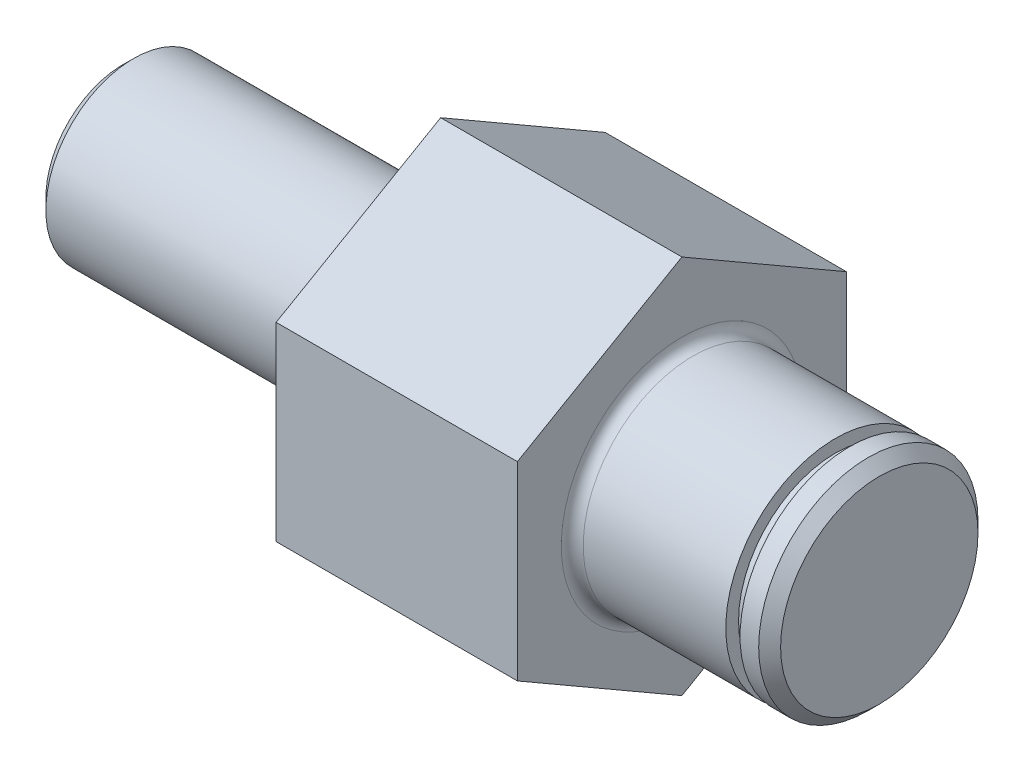
ISO-10303-21;
HEADER;
FILE_DESCRIPTION(('STEP AP214'),'2;1');
FILE_NAME('part.step','',(''),(''),'','','');
FILE_SCHEMA(('AUTOMOTIVE_DESIGN { 1 0 10303 214 1 1 1 1 }'));
ENDSEC;
DATA;
#1=APPLICATION_CONTEXT('core data for automotive mechanical design processes');
#2=APPLICATION_PROTOCOL_DEFINITION('international standard','automotive_design',2000,#1);
#3=PRODUCT_CONTEXT('',#1,'mechanical');
#4=PRODUCT('Part','Part','',(#3));
#5=PRODUCT_RELATED_PRODUCT_CATEGORY('part','',(#4));
#6=PRODUCT_DEFINITION_FORMATION('','',#4);
#7=PRODUCT_DEFINITION_CONTEXT('part definition',#1,'design');
#8=PRODUCT_DEFINITION('design','',#6,#7);
#9=PRODUCT_DEFINITION_SHAPE('','',#8);
#10=(LENGTH_UNIT() NAMED_UNIT(*) SI_UNIT(.MILLI.,.METRE.));
#11=(NAMED_UNIT(*) PLANE_ANGLE_UNIT() SI_UNIT($,.RADIAN.));
#12=(NAMED_UNIT(*) SI_UNIT($,.STERADIAN.) SOLID_ANGLE_UNIT());
#13=UNCERTAINTY_MEASURE_WITH_UNIT(LENGTH_MEASURE(1.E-05),#10,'distance_accuracy_value','');
#14=(GEOMETRIC_REPRESENTATION_CONTEXT(3) GLOBAL_UNCERTAINTY_ASSIGNED_CONTEXT((#13)) GLOBAL_UNIT_ASSIGNED_CONTEXT((#10,
#11,#12)) REPRESENTATION_CONTEXT('',''));
#15=CARTESIAN_POINT('',(0.,0.,0.));
#16=DIRECTION('',(0.,0.,1.));
#17=DIRECTION('',(1.,0.,0.));
#18=AXIS2_PLACEMENT_3D('',#15,#16,#17);
#19=CARTESIAN_POINT('',(69.,0.,0.));
#20=DIRECTION('',(1.,0.,0.));
#21=DIRECTION('',(0.,0.,-1.));
#22=AXIS2_PLACEMENT_3D('',#19,#20,#21);
#23=PLANE('',#22);
#24=CARTESIAN_POINT('',(68.9999999999987,0.,0.));
#25=DIRECTION('',(-1.,0.,0.));
#26=DIRECTION('',(0.,0.,1.));
#27=AXIS2_PLACEMENT_3D('',#24,#25,#26);
#28=CIRCLE('',#27,8.99999999999873);
#29=CARTESIAN_POINT('',(68.9999999999987,0.,8.99999999999873));
#30=VERTEX_POINT('',#29);
#31=EDGE_CURVE('E20',#30,#30,#28,.T.);
#32=ORIENTED_EDGE('',*,*,#31,.F.);
#33=EDGE_LOOP('',(#32));
#34=FACE_BOUND('',#33,.T.);
#35=ADVANCED_FACE('F17',(#34),#23,.T.);
#36=CARTESIAN_POINT('',(68.0000000000013,0.,0.));
#37=DIRECTION('',(-1.,0.,0.));
#38=DIRECTION('',(0.,0.,1.));
#39=AXIS2_PLACEMENT_3D('',#36,#37,#38);
#40=CONICAL_SURFACE('',#39,10.0000000000013,0.785398163400004);
#41=ORIENTED_EDGE('',*,*,#31,.T.);
#42=EDGE_LOOP('',(#41));
#43=FACE_BOUND('',#42,.T.);
#44=CARTESIAN_POINT('',(68.,0.,0.));
#45=DIRECTION('',(1.,0.,0.));
#46=DIRECTION('',(0.,0.,-1.));
#47=AXIS2_PLACEMENT_3D('',#44,#45,#46);
#48=CIRCLE('',#47,10.);
#49=CARTESIAN_POINT('',(68.,0.,-10.));
#50=VERTEX_POINT('',#49);
#51=EDGE_CURVE('E129',#50,#50,#48,.F.);
#52=ORIENTED_EDGE('',*,*,#51,.F.);
#53=EDGE_LOOP('',(#52));
#54=FACE_BOUND('',#53,.T.);
#55=ADVANCED_FACE('F160',(#43,#54),#40,.T.);
#56=CARTESIAN_POINT('',(67.65,0.,0.));
#57=DIRECTION('',(1.,0.,0.));
#58=DIRECTION('',(0.,0.,-1.));
#59=AXIS2_PLACEMENT_3D('',#56,#57,#58);
#60=CYLINDRICAL_SURFACE('',#59,10.);
#61=ORIENTED_EDGE('',*,*,#51,.T.);
#62=EDGE_LOOP('',(#61));
#63=FACE_BOUND('',#62,.T.);
#64=CARTESIAN_POINT('',(66.3,0.,0.));
#65=DIRECTION('',(1.,0.,0.));
#66=DIRECTION('',(0.,0.,-1.));
#67=AXIS2_PLACEMENT_3D('',#64,#65,#66);
#68=CIRCLE('',#67,10.);
#69=CARTESIAN_POINT('',(66.3,0.,-10.));
#70=VERTEX_POINT('',#69);
#71=EDGE_CURVE('E137',#70,#70,#68,.F.);
#72=ORIENTED_EDGE('',*,*,#71,.F.);
#73=EDGE_LOOP('',(#72));
#74=FACE_BOUND('',#73,.T.);
#75=ADVANCED_FACE('F158',(#63,#74),#60,.T.);
#76=CARTESIAN_POINT('',(66.3,10.,0.));
#77=DIRECTION('',(-1.,0.,0.));
#78=DIRECTION('',(0.,0.,1.));
#79=AXIS2_PLACEMENT_3D('',#76,#77,#78);
#80=PLANE('',#79);
#81=CARTESIAN_POINT('',(66.3,0.,0.));
#82=DIRECTION('',(1.,0.,0.));
#83=DIRECTION('',(0.,0.,-1.));
#84=AXIS2_PLACEMENT_3D('',#81,#82,#83);
#85=CIRCLE('',#84,8.83563681192345);
#86=CARTESIAN_POINT('',(66.3,0.,-8.83563681192345));
#87=VERTEX_POINT('',#86);
#88=EDGE_CURVE('E151',#87,#87,#85,.F.);
#89=ORIENTED_EDGE('',*,*,#88,.F.);
#90=EDGE_LOOP('',(#89));
#91=FACE_BOUND('',#90,.T.);
#92=ORIENTED_EDGE('',*,*,#71,.T.);
#93=EDGE_LOOP('',(#92));
#94=FACE_BOUND('',#93,.T.);
#95=ADVANCED_FACE('F156',(#91,#94),#80,.T.);
#96=CARTESIAN_POINT('',(65.65,0.,0.));
#97=DIRECTION('',(1.,0.,0.));
#98=DIRECTION('',(0.,0.,-1.));
#99=AXIS2_PLACEMENT_3D('',#96,#97,#98);
#100=CYLINDRICAL_SURFACE('',#99,8.83563681192345);
#101=ORIENTED_EDGE('',*,*,#88,.T.);
#102=EDGE_LOOP('',(#101));
#103=FACE_BOUND('',#102,.T.);
#104=CARTESIAN_POINT('',(65.,0.,0.));
#105=DIRECTION('',(1.,0.,0.));
#106=DIRECTION('',(0.,0.,-1.));
#107=AXIS2_PLACEMENT_3D('',#104,#105,#106);
#108=CIRCLE('',#107,8.83563681192345);
#109=CARTESIAN_POINT('',(65.,0.,-8.83563681192345));
#110=VERTEX_POINT('',#109);
#111=EDGE_CURVE('E148',#110,#110,#108,.F.);
#112=ORIENTED_EDGE('',*,*,#111,.F.);
#113=EDGE_LOOP('',(#112));
#114=FACE_BOUND('',#113,.T.);
#115=ADVANCED_FACE('F168',(#103,#114),#100,.T.);
#116=CARTESIAN_POINT('',(65.,8.83563681192345,0.));
#117=DIRECTION('',(1.,0.,0.));
#118=DIRECTION('',(0.,0.,-1.));
#119=AXIS2_PLACEMENT_3D('',#116,#117,#118);
#120=PLANE('',#119);
#121=ORIENTED_EDGE('',*,*,#111,.T.);
#122=EDGE_LOOP('',(#121));
#123=FACE_BOUND('',#122,.T.);
#124=CARTESIAN_POINT('',(65.,0.,0.));
#125=DIRECTION('',(1.,0.,0.));
#126=DIRECTION('',(0.,0.,-1.));
#127=AXIS2_PLACEMENT_3D('',#124,#125,#126);
#128=CIRCLE('',#127,10.);
#129=CARTESIAN_POINT('',(65.,0.,-10.));
#130=VERTEX_POINT('',#129);
#131=EDGE_CURVE('E144',#130,#130,#128,.F.);
#132=ORIENTED_EDGE('',*,*,#131,.F.);
#133=EDGE_LOOP('',(#132));
#134=FACE_BOUND('',#133,.T.);
#135=ADVANCED_FACE('F252',(#123,#134),#120,.T.);
#136=CARTESIAN_POINT('',(58.,0.,0.));
#137=DIRECTION('',(1.,0.,0.));
#138=DIRECTION('',(0.,0.,-1.));
#139=AXIS2_PLACEMENT_3D('',#136,#137,#138);
#140=CYLINDRICAL_SURFACE('',#139,10.);
#141=CARTESIAN_POINT('',(52.,0.,0.));
#142=DIRECTION('',(1.,0.,0.));
#143=DIRECTION('',(0.,0.,-1.));
#144=AXIS2_PLACEMENT_3D('',#141,#142,#143);
#145=CIRCLE('',#144,10.);
#146=CARTESIAN_POINT('',(52.,0.,-10.));
#147=VERTEX_POINT('',#146);
#148=EDGE_CURVE('E147',#147,#147,#145,.T.);
#149=ORIENTED_EDGE('',*,*,#148,.T.);
#150=EDGE_LOOP('',(#149));
#151=FACE_BOUND('',#150,.T.);
#152=ORIENTED_EDGE('',*,*,#131,.T.);
#153=EDGE_LOOP('',(#152));
#154=FACE_BOUND('',#153,.T.);
#155=ADVANCED_FACE('F120',(#151,#154),#140,.T.);
#156=CARTESIAN_POINT('',(52.,0.,0.));
#157=DIRECTION('',(1.,0.,0.));
#158=DIRECTION('',(0.,0.,-1.));
#159=AXIS2_PLACEMENT_3D('',#156,#157,#158);
#160=TOROIDAL_SURFACE('',#159,11.,1.);
#161=ORIENTED_EDGE('',*,*,#148,.F.);
#162=EDGE_LOOP('',(#161));
#163=FACE_BOUND('',#162,.T.);
#164=CARTESIAN_POINT('',(51.,0.,0.));
#165=DIRECTION('',(1.,0.,0.));
#166=DIRECTION('',(0.,1.,0.));
#167=AXIS2_PLACEMENT_3D('',#164,#165,#166);
#168=CIRCLE('',#167,11.);
#169=CARTESIAN_POINT('',(51.,11.,0.));
#170=VERTEX_POINT('',#169);
#171=EDGE_CURVE('E81',#170,#170,#168,.F.);
#172=ORIENTED_EDGE('',*,*,#171,.F.);
#173=EDGE_LOOP('',(#172));
#174=FACE_BOUND('',#173,.T.);
#175=ADVANCED_FACE('F115',(#163,#174),#160,.F.);
#176=CARTESIAN_POINT('',(51.,10.,0.));
#177=DIRECTION('',(1.,0.,0.));
#178=DIRECTION('',(0.,0.,-1.));
#179=AXIS2_PLACEMENT_3D('',#176,#177,#178);
#180=PLANE('',#179);
#181=ORIENTED_EDGE('',*,*,#171,.T.);
#182=EDGE_LOOP('',(#181));
#183=FACE_BOUND('',#182,.T.);
#184=DIRECTION('',(0.,1.,0.));
#185=VECTOR('',#184,1.);
#186=CARTESIAN_POINT('',(51.,8.66025403784439,-15.));
#187=LINE('',#186,#185);
#188=CARTESIAN_POINT('',(51.,8.6602540378444,-15.));
#189=VERTEX_POINT('',#188);
#190=CARTESIAN_POINT('',(51.,-8.66025403784439,-15.));
#191=VERTEX_POINT('',#190);
#192=EDGE_CURVE('E85',#189,#191,#187,.F.);
#193=ORIENTED_EDGE('',*,*,#192,.F.);
#194=DIRECTION('',(0.,0.5,0.866025403784439));
#195=VECTOR('',#194,1.);
#196=CARTESIAN_POINT('',(51.,17.3205080756888,0.));
#197=LINE('',#196,#195);
#198=CARTESIAN_POINT('',(51.,17.3205080756888,0.));
#199=VERTEX_POINT('',#198);
#200=EDGE_CURVE('E67',#199,#189,#197,.F.);
#201=ORIENTED_EDGE('',*,*,#200,.F.);
#202=DIRECTION('',(0.,-0.500000000000001,0.866025403784438));
#203=VECTOR('',#202,1.);
#204=CARTESIAN_POINT('',(51.,8.66025403784438,15.));
#205=LINE('',#204,#203);
#206=CARTESIAN_POINT('',(51.,8.66025403784438,15.));
#207=VERTEX_POINT('',#206);
#208=EDGE_CURVE('E72',#207,#199,#205,.F.);
#209=ORIENTED_EDGE('',*,*,#208,.F.);
#210=DIRECTION('',(0.,-1.,0.));
#211=VECTOR('',#210,1.);
#212=CARTESIAN_POINT('',(51.,-8.66025403784439,15.));
#213=LINE('',#212,#211);
#214=CARTESIAN_POINT('',(51.,-8.6602540378444,15.));
#215=VERTEX_POINT('',#214);
#216=EDGE_CURVE('E402',#215,#207,#213,.F.);
#217=ORIENTED_EDGE('',*,*,#216,.F.);
#218=DIRECTION('',(0.,-0.5,-0.866025403784439));
#219=VECTOR('',#218,1.);
#220=CARTESIAN_POINT('',(51.,-17.3205080756888,0.));
#221=LINE('',#220,#219);
#222=CARTESIAN_POINT('',(51.,-17.3205080756888,0.));
#223=VERTEX_POINT('',#222);
#224=EDGE_CURVE('E390',#223,#215,#221,.F.);
#225=ORIENTED_EDGE('',*,*,#224,.F.);
#226=DIRECTION('',(0.,0.5,-0.866025403784439));
#227=VECTOR('',#226,1.);
#228=CARTESIAN_POINT('',(51.,-8.66025403784439,-15.));
#229=LINE('',#228,#227);
#230=EDGE_CURVE('E389',#191,#223,#229,.F.);
#231=ORIENTED_EDGE('',*,*,#230,.F.);
#232=EDGE_LOOP('',(#193,#201,#209,#217,#225,#231));
#233=FACE_BOUND('',#232,.T.);
#234=ADVANCED_FACE('F83',(#183,#233),#180,.T.);
#235=CARTESIAN_POINT('',(51.,8.66025403784438,15.));
#236=DIRECTION('',(0.,0.866025403784438,0.500000000000001));
#237=DIRECTION('',(0.,-0.500000000000001,0.866025403784438));
#238=AXIS2_PLACEMENT_3D('',#235,#236,#237);
#239=PLANE('',#238);
#240=ORIENTED_EDGE('',*,*,#208,.T.);
#241=DIRECTION('',(1.,0.,0.));
#242=VECTOR('',#241,1.);
#243=CARTESIAN_POINT('',(51.,17.3205080756888,0.));
#244=LINE('',#243,#242);
#245=CARTESIAN_POINT('',(29.,17.3205080756888,0.));
#246=VERTEX_POINT('',#245);
#247=EDGE_CURVE('E74',#246,#199,#244,.T.);
#248=ORIENTED_EDGE('',*,*,#247,.F.);
#249=DIRECTION('',(0.,0.500000000000002,-0.866025403784438));
#250=VECTOR('',#249,1.);
#251=CARTESIAN_POINT('',(29.,8.66025403784438,15.));
#252=LINE('',#251,#250);
#253=CARTESIAN_POINT('',(29.,8.66025403784438,15.));
#254=VERTEX_POINT('',#253);
#255=EDGE_CURVE('E404',#254,#246,#252,.T.);
#256=ORIENTED_EDGE('',*,*,#255,.F.);
#257=DIRECTION('',(1.,0.,0.));
#258=VECTOR('',#257,1.);
#259=CARTESIAN_POINT('',(51.,8.66025403784438,15.));
#260=LINE('',#259,#258);
#261=EDGE_CURVE('E77',#207,#254,#260,.F.);
#262=ORIENTED_EDGE('',*,*,#261,.F.);
#263=EDGE_LOOP('',(#240,#248,#256,#262));
#264=FACE_BOUND('',#263,.T.);
#265=ADVANCED_FACE('F73',(#264),#239,.T.);
#266=CARTESIAN_POINT('',(51.,17.3205080756888,0.));
#267=DIRECTION('',(0.,0.866025403784439,-0.5));
#268=DIRECTION('',(0.,0.5,0.866025403784439));
#269=AXIS2_PLACEMENT_3D('',#266,#267,#268);
#270=PLANE('',#269);
#271=ORIENTED_EDGE('',*,*,#200,.T.);
#272=DIRECTION('',(1.,0.,0.));
#273=VECTOR('',#272,1.);
#274=CARTESIAN_POINT('',(51.,8.66025403784439,-15.));
#275=LINE('',#274,#273);
#276=CARTESIAN_POINT('',(29.,8.6602540378444,-15.));
#277=VERTEX_POINT('',#276);
#278=EDGE_CURVE('E87',#277,#189,#275,.T.);
#279=ORIENTED_EDGE('',*,*,#278,.F.);
#280=DIRECTION('',(0.,-0.500000000000001,-0.866025403784438));
#281=VECTOR('',#280,1.);
#282=CARTESIAN_POINT('',(29.,17.3205080756888,0.));
#283=LINE('',#282,#281);
#284=EDGE_CURVE('E91',#246,#277,#283,.T.);
#285=ORIENTED_EDGE('',*,*,#284,.F.);
#286=ORIENTED_EDGE('',*,*,#247,.T.);
#287=EDGE_LOOP('',(#271,#279,#285,#286));
#288=FACE_BOUND('',#287,.T.);
#289=ADVANCED_FACE('F89',(#288),#270,.T.);
#290=CARTESIAN_POINT('',(51.,8.66025403784439,-15.));
#291=DIRECTION('',(0.,0.,-1.));
#292=DIRECTION('',(0.,1.,0.));
#293=AXIS2_PLACEMENT_3D('',#290,#291,#292);
#294=PLANE('',#293);
#295=ORIENTED_EDGE('',*,*,#192,.T.);
#296=DIRECTION('',(1.,0.,0.));
#297=VECTOR('',#296,1.);
#298=CARTESIAN_POINT('',(51.,-8.66025403784439,-15.));
#299=LINE('',#298,#297);
#300=CARTESIAN_POINT('',(29.,-8.66025403784439,-15.));
#301=VERTEX_POINT('',#300);
#302=EDGE_CURVE('E385',#301,#191,#299,.T.);
#303=ORIENTED_EDGE('',*,*,#302,.F.);
#304=DIRECTION('',(0.,1.,0.));
#305=VECTOR('',#304,1.);
#306=CARTESIAN_POINT('',(29.,20.,-15.));
#307=LINE('',#306,#305);
#308=EDGE_CURVE('E416',#277,#301,#307,.F.);
#309=ORIENTED_EDGE('',*,*,#308,.F.);
#310=ORIENTED_EDGE('',*,*,#278,.T.);
#311=EDGE_LOOP('',(#295,#303,#309,#310));
#312=FACE_BOUND('',#311,.T.);
#313=ADVANCED_FACE('F226',(#312),#294,.T.);
#314=CARTESIAN_POINT('',(51.,-8.66025403784439,-15.));
#315=DIRECTION('',(0.,-0.866025403784439,-0.5));
#316=DIRECTION('',(0.,0.5,-0.866025403784439));
#317=AXIS2_PLACEMENT_3D('',#314,#315,#316);
#318=PLANE('',#317);
#319=ORIENTED_EDGE('',*,*,#230,.T.);
#320=DIRECTION('',(1.,0.,0.));
#321=VECTOR('',#320,1.);
#322=CARTESIAN_POINT('',(51.,-17.3205080756888,0.));
#323=LINE('',#322,#321);
#324=CARTESIAN_POINT('',(29.,-17.3205080756888,0.));
#325=VERTEX_POINT('',#324);
#326=EDGE_CURVE('E392',#325,#223,#323,.T.);
#327=ORIENTED_EDGE('',*,*,#326,.F.);
#328=DIRECTION('',(0.,-0.500000000000001,0.866025403784438));
#329=VECTOR('',#328,1.);
#330=CARTESIAN_POINT('',(29.,-8.66025403784439,-15.));
#331=LINE('',#330,#329);
#332=EDGE_CURVE('E395',#301,#325,#331,.T.);
#333=ORIENTED_EDGE('',*,*,#332,.F.);
#334=ORIENTED_EDGE('',*,*,#302,.T.);
#335=EDGE_LOOP('',(#319,#327,#333,#334));
#336=FACE_BOUND('',#335,.T.);
#337=ADVANCED_FACE('F223',(#336),#318,.T.);
#338=CARTESIAN_POINT('',(51.,-17.3205080756888,0.));
#339=DIRECTION('',(0.,-0.866025403784439,0.5));
#340=DIRECTION('',(0.,-0.5,-0.866025403784439));
#341=AXIS2_PLACEMENT_3D('',#338,#339,#340);
#342=PLANE('',#341);
#343=ORIENTED_EDGE('',*,*,#224,.T.);
#344=DIRECTION('',(1.,0.,0.));
#345=VECTOR('',#344,1.);
#346=CARTESIAN_POINT('',(51.,-8.66025403784439,15.));
#347=LINE('',#346,#345);
#348=CARTESIAN_POINT('',(29.,-8.6602540378444,15.));
#349=VERTEX_POINT('',#348);
#350=EDGE_CURVE('E35',#349,#215,#347,.T.);
#351=ORIENTED_EDGE('',*,*,#350,.F.);
#352=DIRECTION('',(0.,0.500000000000001,0.866025403784438));
#353=VECTOR('',#352,1.);
#354=CARTESIAN_POINT('',(29.,-17.3205080756888,0.));
#355=LINE('',#354,#353);
#356=EDGE_CURVE('E418',#325,#349,#355,.T.);
#357=ORIENTED_EDGE('',*,*,#356,.F.);
#358=ORIENTED_EDGE('',*,*,#326,.T.);
#359=EDGE_LOOP('',(#343,#351,#357,#358));
#360=FACE_BOUND('',#359,.T.);
#361=ADVANCED_FACE('F219',(#360),#342,.T.);
#362=CARTESIAN_POINT('',(51.,-8.66025403784439,15.));
#363=DIRECTION('',(0.,0.,1.));
#364=DIRECTION('',(0.,-1.,0.));
#365=AXIS2_PLACEMENT_3D('',#362,#363,#364);
#366=PLANE('',#365);
#367=ORIENTED_EDGE('',*,*,#216,.T.);
#368=ORIENTED_EDGE('',*,*,#261,.T.);
#369=DIRECTION('',(0.,1.,0.));
#370=VECTOR('',#369,1.);
#371=CARTESIAN_POINT('',(29.,20.,15.));
#372=LINE('',#371,#370);
#373=EDGE_CURVE('E205',#349,#254,#372,.T.);
#374=ORIENTED_EDGE('',*,*,#373,.F.);
#375=ORIENTED_EDGE('',*,*,#350,.T.);
#376=EDGE_LOOP('',(#367,#368,#374,#375));
#377=FACE_BOUND('',#376,.T.);
#378=ADVANCED_FACE('F216',(#377),#366,.T.);
#379=CARTESIAN_POINT('',(29.,20.,0.));
#380=DIRECTION('',(-1.,0.,0.));
#381=DIRECTION('',(0.,0.,1.));
#382=AXIS2_PLACEMENT_3D('',#379,#380,#381);
#383=PLANE('',#382);
#384=CARTESIAN_POINT('',(29.,0.,0.));
#385=DIRECTION('',(-1.,0.,0.));
#386=DIRECTION('',(0.,1.,0.));
#387=AXIS2_PLACEMENT_3D('',#384,#385,#386);
#388=CIRCLE('',#387,9.);
#389=CARTESIAN_POINT('',(29.,9.,0.));
#390=VERTEX_POINT('',#389);
#391=EDGE_CURVE('E143',#390,#390,#388,.F.);
#392=ORIENTED_EDGE('',*,*,#391,.T.);
#393=EDGE_LOOP('',(#392));
#394=FACE_BOUND('',#393,.T.);
#395=ORIENTED_EDGE('',*,*,#356,.T.);
#396=ORIENTED_EDGE('',*,*,#373,.T.);
#397=ORIENTED_EDGE('',*,*,#255,.T.);
#398=ORIENTED_EDGE('',*,*,#284,.T.);
#399=ORIENTED_EDGE('',*,*,#308,.T.);
#400=ORIENTED_EDGE('',*,*,#332,.T.);
#401=EDGE_LOOP('',(#395,#396,#397,#398,#399,#400));
#402=FACE_BOUND('',#401,.T.);
#403=ADVANCED_FACE('F207',(#394,#402),#383,.T.);
#404=CARTESIAN_POINT('',(0.,8.,0.));
#405=DIRECTION('',(-1.,0.,0.));
#406=DIRECTION('',(0.,0.,1.));
#407=AXIS2_PLACEMENT_3D('',#404,#405,#406);
#408=PLANE('',#407);
#409=CARTESIAN_POINT('',(1.27653963788443E-12,0.,0.));
#410=DIRECTION('',(1.,0.,0.));
#411=DIRECTION('',(0.,0.,-1.));
#412=AXIS2_PLACEMENT_3D('',#409,#410,#411);
#413=CIRCLE('',#412,6.99999999999872);
#414=CARTESIAN_POINT('',(1.27644477019434E-12,0.,-6.99999999999872));
#415=VERTEX_POINT('',#414);
#416=EDGE_CURVE('E140',#415,#415,#413,.T.);
#417=ORIENTED_EDGE('',*,*,#416,.F.);
#418=EDGE_LOOP('',(#417));
#419=FACE_BOUND('',#418,.T.);
#420=ADVANCED_FACE('F189',(#419),#408,.T.);
#421=CARTESIAN_POINT('',(28.,0.,0.));
#422=DIRECTION('',(1.,0.,0.));
#423=DIRECTION('',(0.,0.,-1.));
#424=AXIS2_PLACEMENT_3D('',#421,#422,#423);
#425=TOROIDAL_SURFACE('',#424,9.,1.);
#426=ORIENTED_EDGE('',*,*,#391,.F.);
#427=EDGE_LOOP('',(#426));
#428=FACE_BOUND('',#427,.T.);
#429=CARTESIAN_POINT('',(28.,0.,0.));
#430=DIRECTION('',(1.,0.,0.));
#431=DIRECTION('',(0.,0.,-1.));
#432=AXIS2_PLACEMENT_3D('',#429,#430,#431);
#433=CIRCLE('',#432,8.);
#434=CARTESIAN_POINT('',(28.,0.,-8.));
#435=VERTEX_POINT('',#434);
#436=EDGE_CURVE('E26',#435,#435,#433,.F.);
#437=ORIENTED_EDGE('',*,*,#436,.F.);
#438=EDGE_LOOP('',(#437));
#439=FACE_BOUND('',#438,.T.);
#440=ADVANCED_FACE('F180',(#428,#439),#425,.F.);
#441=CARTESIAN_POINT('',(0.999999999998724,0.,0.));
#442=DIRECTION('',(1.,0.,0.));
#443=DIRECTION('',(0.,0.,-1.));
#444=AXIS2_PLACEMENT_3D('',#441,#442,#443);
#445=CONICAL_SURFACE('',#444,8.00000000000128,0.7853981634);
#446=CARTESIAN_POINT('',(0.999999999999999,0.,0.));
#447=DIRECTION('',(1.,0.,0.));
#448=DIRECTION('',(0.,0.,-1.));
#449=AXIS2_PLACEMENT_3D('',#446,#447,#448);
#450=CIRCLE('',#449,8.);
#451=CARTESIAN_POINT('',(0.999999999999999,0.,-8.));
#452=VERTEX_POINT('',#451);
#453=EDGE_CURVE('E11',#452,#452,#450,.T.);
#454=ORIENTED_EDGE('',*,*,#453,.F.);
#455=EDGE_LOOP('',(#454));
#456=FACE_BOUND('',#455,.T.);
#457=ORIENTED_EDGE('',*,*,#416,.T.);
#458=EDGE_LOOP('',(#457));
#459=FACE_BOUND('',#458,.T.);
#460=ADVANCED_FACE('F174',(#456,#459),#445,.T.);
#461=CARTESIAN_POINT('',(14.5,0.,0.));
#462=DIRECTION('',(1.,0.,0.));
#463=DIRECTION('',(0.,0.,-1.));
#464=AXIS2_PLACEMENT_3D('',#461,#462,#463);
#465=CYLINDRICAL_SURFACE('',#464,8.);
#466=ORIENTED_EDGE('',*,*,#453,.T.);
#467=EDGE_LOOP('',(#466));
#468=FACE_BOUND('',#467,.T.);
#469=ORIENTED_EDGE('',*,*,#436,.T.);
#470=EDGE_LOOP('',(#469));
#471=FACE_BOUND('',#470,.T.);
#472=ADVANCED_FACE('F172',(#468,#471),#465,.T.);
#473=CLOSED_SHELL('',(#35,#55,#75,#95,#115,#135,#155,#175,#234,#265,#289,#313,#337,#361,#378,
#403,#420,#440,#460,#472));
#474=MANIFOLD_SOLID_BREP('B1',#473);
#475=ADVANCED_BREP_SHAPE_REPRESENTATION('',(#18,#474),#14);
#476=SHAPE_DEFINITION_REPRESENTATION(#9,#475);
ENDSEC;
END-ISO-10303-21;
